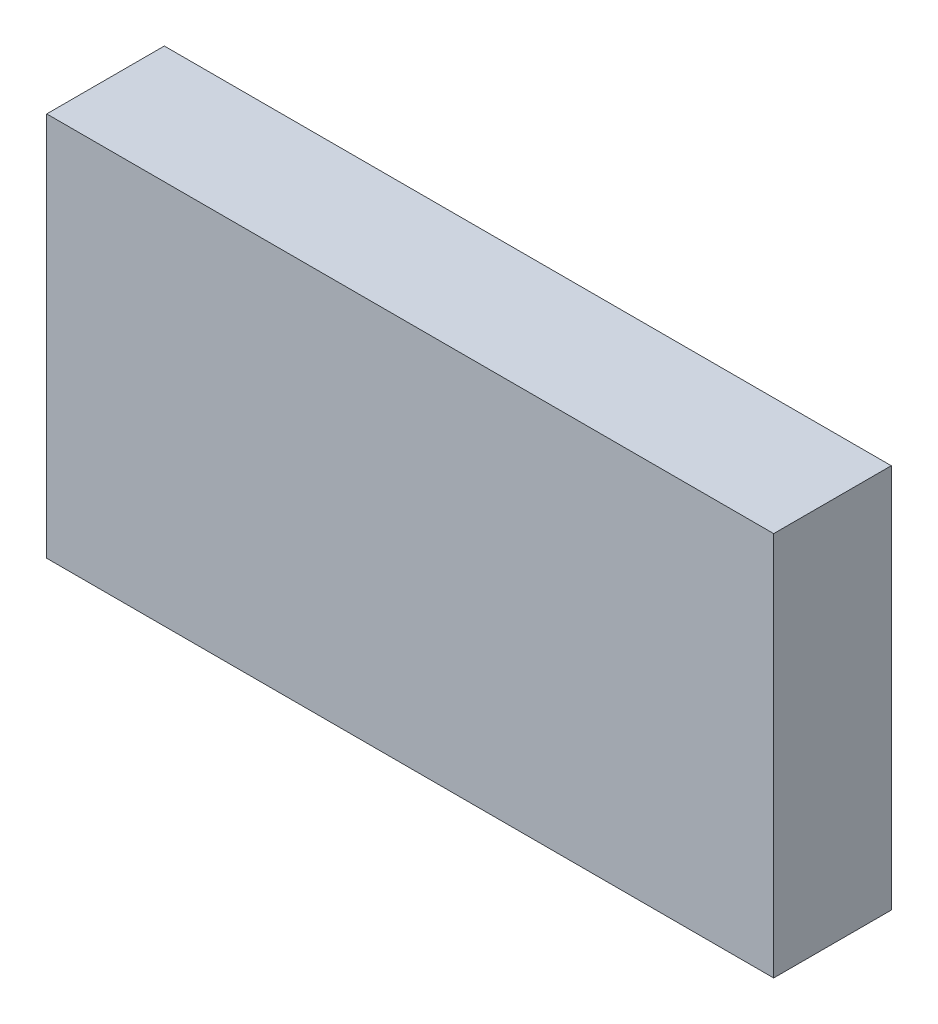
ISO-10303-21;
HEADER;
FILE_DESCRIPTION(('STEP AP214'),'2;1');
FILE_NAME('part.step','',(''),(''),'','','');
FILE_SCHEMA(('AUTOMOTIVE_DESIGN { 1 0 10303 214 1 1 1 1 }'));
ENDSEC;
DATA;
#1=APPLICATION_CONTEXT('core data for automotive mechanical design processes');
#2=APPLICATION_PROTOCOL_DEFINITION('international standard','automotive_design',2000,#1);
#3=PRODUCT_CONTEXT('',#1,'mechanical');
#4=PRODUCT('Part','Part','',(#3));
#5=PRODUCT_RELATED_PRODUCT_CATEGORY('part','',(#4));
#6=PRODUCT_DEFINITION_FORMATION('','',#4);
#7=PRODUCT_DEFINITION_CONTEXT('part definition',#1,'design');
#8=PRODUCT_DEFINITION('design','',#6,#7);
#9=PRODUCT_DEFINITION_SHAPE('','',#8);
#10=(LENGTH_UNIT() NAMED_UNIT(*) SI_UNIT(.MILLI.,.METRE.));
#11=(NAMED_UNIT(*) PLANE_ANGLE_UNIT() SI_UNIT($,.RADIAN.));
#12=(NAMED_UNIT(*) SI_UNIT($,.STERADIAN.) SOLID_ANGLE_UNIT());
#13=UNCERTAINTY_MEASURE_WITH_UNIT(LENGTH_MEASURE(1.E-05),#10,'distance_accuracy_value','');
#14=(GEOMETRIC_REPRESENTATION_CONTEXT(3) GLOBAL_UNCERTAINTY_ASSIGNED_CONTEXT((#13)) GLOBAL_UNIT_ASSIGNED_CONTEXT((#10,
#11,#12)) REPRESENTATION_CONTEXT('',''));
#15=CARTESIAN_POINT('',(0.,0.,0.));
#16=DIRECTION('',(0.,0.,1.));
#17=DIRECTION('',(1.,0.,0.));
#18=AXIS2_PLACEMENT_3D('',#15,#16,#17);
#19=CARTESIAN_POINT('',(1.69999914,-0.90000074,0.5499989));
#20=DIRECTION('',(0.,0.,1.));
#21=DIRECTION('',(1.,0.,0.));
#22=AXIS2_PLACEMENT_3D('',#19,#20,#21);
#23=PLANE('',#22);
#24=DIRECTION('',(0.,1.,0.));
#25=VECTOR('',#24,1.);
#26=CARTESIAN_POINT('',(-1.69999914,-0.90000074,0.5499989));
#27=LINE('',#26,#25);
#28=CARTESIAN_POINT('',(-1.69999914,-0.90000074,0.5499989));
#29=VERTEX_POINT('',#28);
#30=CARTESIAN_POINT('',(-1.69999914,0.90000074,0.5499989));
#31=VERTEX_POINT('',#30);
#32=EDGE_CURVE('E53',#29,#31,#27,.T.);
#33=ORIENTED_EDGE('',*,*,#32,.F.);
#34=DIRECTION('',(1.,0.,0.));
#35=VECTOR('',#34,1.);
#36=CARTESIAN_POINT('',(1.69999914,-0.90000074,0.5499989));
#37=LINE('',#36,#35);
#38=CARTESIAN_POINT('',(1.69999914,-0.90000074,0.5499989));
#39=VERTEX_POINT('',#38);
#40=EDGE_CURVE('E68',#39,#29,#37,.F.);
#41=ORIENTED_EDGE('',*,*,#40,.F.);
#42=DIRECTION('',(0.,1.,0.));
#43=VECTOR('',#42,1.);
#44=CARTESIAN_POINT('',(1.69999914,0.90000074,0.5499989));
#45=LINE('',#44,#43);
#46=CARTESIAN_POINT('',(1.69999914,0.90000074,0.5499989));
#47=VERTEX_POINT('',#46);
#48=EDGE_CURVE('E20',#47,#39,#45,.F.);
#49=ORIENTED_EDGE('',*,*,#48,.F.);
#50=DIRECTION('',(1.,0.,0.));
#51=VECTOR('',#50,1.);
#52=CARTESIAN_POINT('',(-1.69999914,0.90000074,0.5499989));
#53=LINE('',#52,#51);
#54=EDGE_CURVE('E58',#31,#47,#53,.T.);
#55=ORIENTED_EDGE('',*,*,#54,.F.);
#56=EDGE_LOOP('',(#33,#41,#49,#55));
#57=FACE_BOUND('',#56,.T.);
#58=ADVANCED_FACE('F17',(#57),#23,.T.);
#59=CARTESIAN_POINT('',(1.69999914,0.90000074,0.));
#60=DIRECTION('',(1.,0.,0.));
#61=DIRECTION('',(0.,0.,-1.));
#62=AXIS2_PLACEMENT_3D('',#59,#60,#61);
#63=PLANE('',#62);
#64=DIRECTION('',(0.,0.,-1.));
#65=VECTOR('',#64,1.);
#66=CARTESIAN_POINT('',(1.69999914,-0.90000074,0.));
#67=LINE('',#66,#65);
#68=CARTESIAN_POINT('',(1.69999914,-0.90000074,0.));
#69=VERTEX_POINT('',#68);
#70=EDGE_CURVE('E79',#69,#39,#67,.F.);
#71=ORIENTED_EDGE('',*,*,#70,.F.);
#72=DIRECTION('',(0.,1.,0.));
#73=VECTOR('',#72,1.);
#74=CARTESIAN_POINT('',(1.69999914,-0.90000074,0.));
#75=LINE('',#74,#73);
#76=CARTESIAN_POINT('',(1.69999914,0.90000074,0.));
#77=VERTEX_POINT('',#76);
#78=EDGE_CURVE('E74',#69,#77,#75,.T.);
#79=ORIENTED_EDGE('',*,*,#78,.T.);
#80=DIRECTION('',(0.,0.,1.));
#81=VECTOR('',#80,1.);
#82=CARTESIAN_POINT('',(1.69999914,0.90000074,0.));
#83=LINE('',#82,#81);
#84=EDGE_CURVE('E63',#47,#77,#83,.F.);
#85=ORIENTED_EDGE('',*,*,#84,.F.);
#86=ORIENTED_EDGE('',*,*,#48,.T.);
#87=EDGE_LOOP('',(#71,#79,#85,#86));
#88=FACE_BOUND('',#87,.T.);
#89=ADVANCED_FACE('F73',(#88),#63,.T.);
#90=CARTESIAN_POINT('',(-1.69999914,0.90000074,0.));
#91=DIRECTION('',(0.,1.,0.));
#92=DIRECTION('',(0.,0.,1.));
#93=AXIS2_PLACEMENT_3D('',#90,#91,#92);
#94=PLANE('',#93);
#95=ORIENTED_EDGE('',*,*,#84,.T.);
#96=DIRECTION('',(1.,0.,0.));
#97=VECTOR('',#96,1.);
#98=CARTESIAN_POINT('',(1.69999914,0.90000074,0.));
#99=LINE('',#98,#97);
#100=CARTESIAN_POINT('',(-1.69999914,0.90000074,0.));
#101=VERTEX_POINT('',#100);
#102=EDGE_CURVE('E84',#77,#101,#99,.F.);
#103=ORIENTED_EDGE('',*,*,#102,.T.);
#104=DIRECTION('',(0.,0.,1.));
#105=VECTOR('',#104,1.);
#106=CARTESIAN_POINT('',(-1.69999914,0.90000074,0.));
#107=LINE('',#106,#105);
#108=EDGE_CURVE('E65',#31,#101,#107,.F.);
#109=ORIENTED_EDGE('',*,*,#108,.F.);
#110=ORIENTED_EDGE('',*,*,#54,.T.);
#111=EDGE_LOOP('',(#95,#103,#109,#110));
#112=FACE_BOUND('',#111,.T.);
#113=ADVANCED_FACE('F60',(#112),#94,.T.);
#114=CARTESIAN_POINT('',(-1.69999914,-0.90000074,0.));
#115=DIRECTION('',(-1.,0.,0.));
#116=DIRECTION('',(0.,0.,1.));
#117=AXIS2_PLACEMENT_3D('',#114,#115,#116);
#118=PLANE('',#117);
#119=ORIENTED_EDGE('',*,*,#108,.T.);
#120=DIRECTION('',(0.,1.,0.));
#121=VECTOR('',#120,1.);
#122=CARTESIAN_POINT('',(-1.69999914,-0.90000074,0.));
#123=LINE('',#122,#121);
#124=CARTESIAN_POINT('',(-1.69999914,-0.90000074,0.));
#125=VERTEX_POINT('',#124);
#126=EDGE_CURVE('E26',#101,#125,#123,.F.);
#127=ORIENTED_EDGE('',*,*,#126,.T.);
#128=DIRECTION('',(0.,0.,-1.));
#129=VECTOR('',#128,1.);
#130=CARTESIAN_POINT('',(-1.69999914,-0.90000074,0.));
#131=LINE('',#130,#129);
#132=EDGE_CURVE('E34',#29,#125,#131,.T.);
#133=ORIENTED_EDGE('',*,*,#132,.F.);
#134=ORIENTED_EDGE('',*,*,#32,.T.);
#135=EDGE_LOOP('',(#119,#127,#133,#134));
#136=FACE_BOUND('',#135,.T.);
#137=ADVANCED_FACE('F88',(#136),#118,.T.);
#138=CARTESIAN_POINT('',(1.69999914,-0.90000074,0.));
#139=DIRECTION('',(0.,-1.,0.));
#140=DIRECTION('',(0.,0.,-1.));
#141=AXIS2_PLACEMENT_3D('',#138,#139,#140);
#142=PLANE('',#141);
#143=ORIENTED_EDGE('',*,*,#132,.T.);
#144=DIRECTION('',(1.,0.,0.));
#145=VECTOR('',#144,1.);
#146=CARTESIAN_POINT('',(1.69999914,-0.90000074,0.));
#147=LINE('',#146,#145);
#148=EDGE_CURVE('E11',#125,#69,#147,.T.);
#149=ORIENTED_EDGE('',*,*,#148,.T.);
#150=ORIENTED_EDGE('',*,*,#70,.T.);
#151=ORIENTED_EDGE('',*,*,#40,.T.);
#152=EDGE_LOOP('',(#143,#149,#150,#151));
#153=FACE_BOUND('',#152,.T.);
#154=ADVANCED_FACE('F91',(#153),#142,.T.);
#155=CARTESIAN_POINT('',(1.69999914,-0.90000074,0.));
#156=DIRECTION('',(0.,0.,1.));
#157=DIRECTION('',(1.,0.,0.));
#158=AXIS2_PLACEMENT_3D('',#155,#156,#157);
#159=PLANE('',#158);
#160=ORIENTED_EDGE('',*,*,#126,.F.);
#161=ORIENTED_EDGE('',*,*,#102,.F.);
#162=ORIENTED_EDGE('',*,*,#78,.F.);
#163=ORIENTED_EDGE('',*,*,#148,.F.);
#164=EDGE_LOOP('',(#160,#161,#162,#163));
#165=FACE_BOUND('',#164,.T.);
#166=ADVANCED_FACE('F90',(#165),#159,.F.);
#167=CLOSED_SHELL('',(#58,#89,#113,#137,#154,#166));
#168=MANIFOLD_SOLID_BREP('B1',#167);
#169=ADVANCED_BREP_SHAPE_REPRESENTATION('',(#18,#168),#14);
#170=SHAPE_DEFINITION_REPRESENTATION(#9,#169);
ENDSEC;
END-ISO-10303-21;
